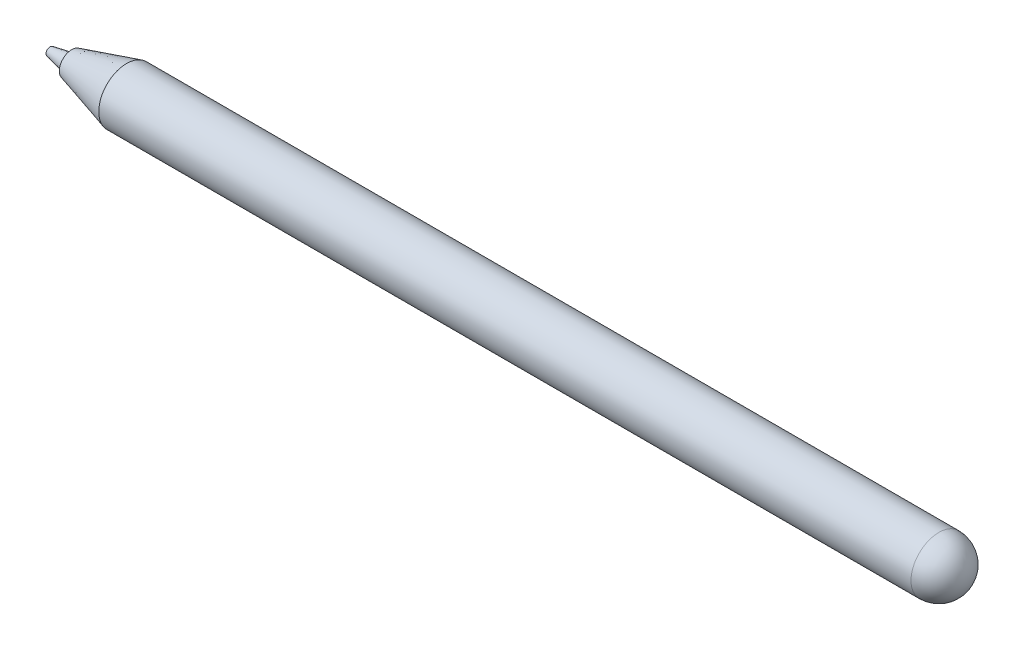
ISO-10303-21;
HEADER;
FILE_DESCRIPTION(('STEP AP214'),'2;1');
FILE_NAME('part.step','',(''),(''),'','','');
FILE_SCHEMA(('AUTOMOTIVE_DESIGN { 1 0 10303 214 1 1 1 1 }'));
ENDSEC;
DATA;
#1=APPLICATION_CONTEXT('core data for automotive mechanical design processes');
#2=APPLICATION_PROTOCOL_DEFINITION('international standard','automotive_design',2000,#1);
#3=PRODUCT_CONTEXT('',#1,'mechanical');
#4=PRODUCT('Part','Part','',(#3));
#5=PRODUCT_RELATED_PRODUCT_CATEGORY('part','',(#4));
#6=PRODUCT_DEFINITION_FORMATION('','',#4);
#7=PRODUCT_DEFINITION_CONTEXT('part definition',#1,'design');
#8=PRODUCT_DEFINITION('design','',#6,#7);
#9=PRODUCT_DEFINITION_SHAPE('','',#8);
#10=(LENGTH_UNIT() NAMED_UNIT(*) SI_UNIT(.MILLI.,.METRE.));
#11=(NAMED_UNIT(*) PLANE_ANGLE_UNIT() SI_UNIT($,.RADIAN.));
#12=(NAMED_UNIT(*) SI_UNIT($,.STERADIAN.) SOLID_ANGLE_UNIT());
#13=UNCERTAINTY_MEASURE_WITH_UNIT(LENGTH_MEASURE(1.E-05),#10,'distance_accuracy_value','');
#14=(GEOMETRIC_REPRESENTATION_CONTEXT(3) GLOBAL_UNCERTAINTY_ASSIGNED_CONTEXT((#13)) GLOBAL_UNIT_ASSIGNED_CONTEXT((#10,
#11,#12)) REPRESENTATION_CONTEXT('',''));
#15=CARTESIAN_POINT('',(0.,0.,0.));
#16=DIRECTION('',(0.,0.,1.));
#17=DIRECTION('',(1.,0.,0.));
#18=AXIS2_PLACEMENT_3D('',#15,#16,#17);
#19=CARTESIAN_POINT('',(0.,-0.467987089571111,0.));
#20=DIRECTION('',(-0.999702730528813,0.0243813570835548,0.));
#21=DIRECTION('',(-0.0243813570835548,-0.999702730528813,0.));
#22=AXIS2_PLACEMENT_3D('',#19,#20,#21);
#23=CONICAL_SURFACE('',#22,0.,1.54641255347966);
#24=CARTESIAN_POINT('',(-0.181096019928613,-0.46357040989879,0.));
#25=DIRECTION('',(-0.999702730528813,0.0243813570835548,0.));
#26=DIRECTION('',(-0.0243813570835548,-0.999702730528813,0.));
#27=AXIS2_PLACEMENT_3D('',#24,#25,#26);
#28=CIRCLE('',#27,7.42764314996928);
#29=CARTESIAN_POINT('',(-0.362192039857234,-7.88900554831671,0.));
#30=VERTEX_POINT('',#29);
#31=EDGE_CURVE('E12',#30,#30,#28,.T.);
#32=ORIENTED_EDGE('',*,*,#31,.F.);
#33=EDGE_LOOP('',(#32));
#34=FACE_BOUND('',#33,.T.);
#35=CARTESIAN_POINT('',(0.,-0.467987089571111,0.));
#36=VERTEX_POINT('',#35);
#37=VERTEX_LOOP('',#36);
#38=FACE_BOUND('',#37,.T.);
#39=ADVANCED_FACE('F48',(#34,#38),#23,.T.);
#40=CARTESIAN_POINT('',(-0.181096019928613,-0.46357040989879,0.));
#41=DIRECTION('',(0.999702730528813,-0.0243813570835548,0.));
#42=DIRECTION('',(0.0243813570835548,0.999702730528813,0.));
#43=AXIS2_PLACEMENT_3D('',#40,#41,#42);
#44=CONICAL_SURFACE('',#43,7.42764314996927,0.200818732184822);
#45=CARTESIAN_POINT('',(-19.2750604197118,0.00210478529202587,0.));
#46=DIRECTION('',(-0.999702730528813,0.0243813570835548,0.));
#47=DIRECTION('',(-0.0243813570835548,-0.999702730528813,0.));
#48=AXIS2_PLACEMENT_3D('',#45,#46,#47);
#49=CIRCLE('',#48,3.53967124997701);
#50=CARTESIAN_POINT('',(-19.3613624084158,-3.53651422848433,0.));
#51=VERTEX_POINT('',#50);
#52=EDGE_CURVE('E55',#51,#51,#49,.T.);
#53=ORIENTED_EDGE('',*,*,#52,.F.);
#54=EDGE_LOOP('',(#53));
#55=FACE_BOUND('',#54,.T.);
#56=ORIENTED_EDGE('',*,*,#31,.T.);
#57=EDGE_LOOP('',(#56));
#58=FACE_BOUND('',#57,.T.);
#59=ADVANCED_FACE('F62',(#55,#58),#44,.T.);
#60=CARTESIAN_POINT('',(-19.2750604197118,0.00210478529202587,0.));
#61=DIRECTION('',(-0.999702730528813,0.0243813570835548,0.));
#62=DIRECTION('',(-0.0243813570835548,-0.999702730528813,0.));
#63=AXIS2_PLACEMENT_3D('',#60,#61,#62);
#64=CONICAL_SURFACE('',#63,3.53967124997701,1.54641255347966);
#65=CARTESIAN_POINT('',(-19.1887584310077,0.,0.));
#66=VERTEX_POINT('',#65);
#67=VERTEX_LOOP('',#66);
#68=FACE_BOUND('',#67,.T.);
#69=ORIENTED_EDGE('',*,*,#52,.T.);
#70=EDGE_LOOP('',(#69));
#71=FACE_BOUND('',#70,.T.);
#72=ADVANCED_FACE('F67',(#68,#71),#64,.F.);
#73=CLOSED_SHELL('',(#39,#59,#72));
#74=MANIFOLD_SOLID_BREP('B2',#73);
#75=CARTESIAN_POINT('',(0.,10.9449333694786,0.));
#76=DIRECTION('',(1.,0.,0.));
#77=DIRECTION('',(0.,0.,-1.));
#78=AXIS2_PLACEMENT_3D('',#75,#76,#77);
#79=PLANE('',#78);
#80=CARTESIAN_POINT('',(0.,0.,0.));
#81=DIRECTION('',(-1.,0.,0.));
#82=DIRECTION('',(0.,0.,1.));
#83=AXIS2_PLACEMENT_3D('',#80,#81,#82);
#84=CIRCLE('',#83,10.9449333694786);
#85=CARTESIAN_POINT('',(0.,0.,10.9449333694786));
#86=VERTEX_POINT('',#85);
#87=EDGE_CURVE('E102',#86,#86,#84,.T.);
#88=ORIENTED_EDGE('',*,*,#87,.T.);
#89=EDGE_LOOP('',(#88));
#90=FACE_BOUND('',#89,.T.);
#91=ADVANCED_FACE('F95',(#90),#79,.F.);
#92=CARTESIAN_POINT('',(0.,0.,0.));
#93=DIRECTION('',(-1.,0.,0.));
#94=DIRECTION('',(0.,0.,1.));
#95=AXIS2_PLACEMENT_3D('',#92,#93,#94);
#96=CYLINDRICAL_SURFACE('',#95,24.6977292264151);
#97=CARTESIAN_POINT('',(48.776692205796,0.,0.));
#98=DIRECTION('',(-1.,0.,0.));
#99=DIRECTION('',(0.,0.,1.));
#100=AXIS2_PLACEMENT_3D('',#97,#98,#99);
#101=CIRCLE('',#100,24.6977292264151);
#102=CARTESIAN_POINT('',(48.776692205796,0.,24.6977292264151));
#103=VERTEX_POINT('',#102);
#104=EDGE_CURVE('E47',#103,#103,#101,.T.);
#105=ORIENTED_EDGE('',*,*,#104,.F.);
#106=EDGE_LOOP('',(#105));
#107=FACE_BOUND('',#106,.T.);
#108=CARTESIAN_POINT('',(770.319388493793,0.,0.));
#109=DIRECTION('',(-1.,0.,0.));
#110=DIRECTION('',(0.,0.,1.));
#111=AXIS2_PLACEMENT_3D('',#108,#109,#110);
#112=CIRCLE('',#111,24.6977292264151);
#113=CARTESIAN_POINT('',(770.319388493793,0.,24.6977292264151));
#114=VERTEX_POINT('',#113);
#115=EDGE_CURVE('E107',#114,#114,#112,.T.);
#116=ORIENTED_EDGE('',*,*,#115,.T.);
#117=EDGE_LOOP('',(#116));
#118=FACE_BOUND('',#117,.T.);
#119=ADVANCED_FACE('F115',(#107,#118),#96,.T.);
#120=CARTESIAN_POINT('',(48.776692205796,0.,0.));
#121=DIRECTION('',(1.,0.,0.));
#122=DIRECTION('',(0.,0.,-1.));
#123=AXIS2_PLACEMENT_3D('',#120,#121,#122);
#124=CONICAL_SURFACE('',#123,24.6977292264151,0.274819961084385);
#125=ORIENTED_EDGE('',*,*,#87,.F.);
#126=EDGE_LOOP('',(#125));
#127=FACE_BOUND('',#126,.T.);
#128=ORIENTED_EDGE('',*,*,#104,.T.);
#129=EDGE_LOOP('',(#128));
#130=FACE_BOUND('',#129,.T.);
#131=ADVANCED_FACE('F119',(#127,#130),#124,.T.);
#132=CARTESIAN_POINT('',(770.319388493793,0.,0.));
#133=DIRECTION('',(-1.,0.,0.));
#134=DIRECTION('',(0.,1.,0.));
#135=AXIS2_PLACEMENT_3D('',#132,#133,#134);
#136=SPHERICAL_SURFACE('',#135,24.6977292264151);
#137=ORIENTED_EDGE('',*,*,#115,.F.);
#138=EDGE_LOOP('',(#137));
#139=FACE_BOUND('',#138,.T.);
#140=ADVANCED_FACE('F117',(#139),#136,.T.);
#141=CLOSED_SHELL('',(#91,#119,#131,#140));
#142=MANIFOLD_SOLID_BREP('B6',#141);
#143=ADVANCED_BREP_SHAPE_REPRESENTATION('',(#18,#74,#142),#14);
#144=SHAPE_DEFINITION_REPRESENTATION(#9,#143);
ENDSEC;
END-ISO-10303-21;
